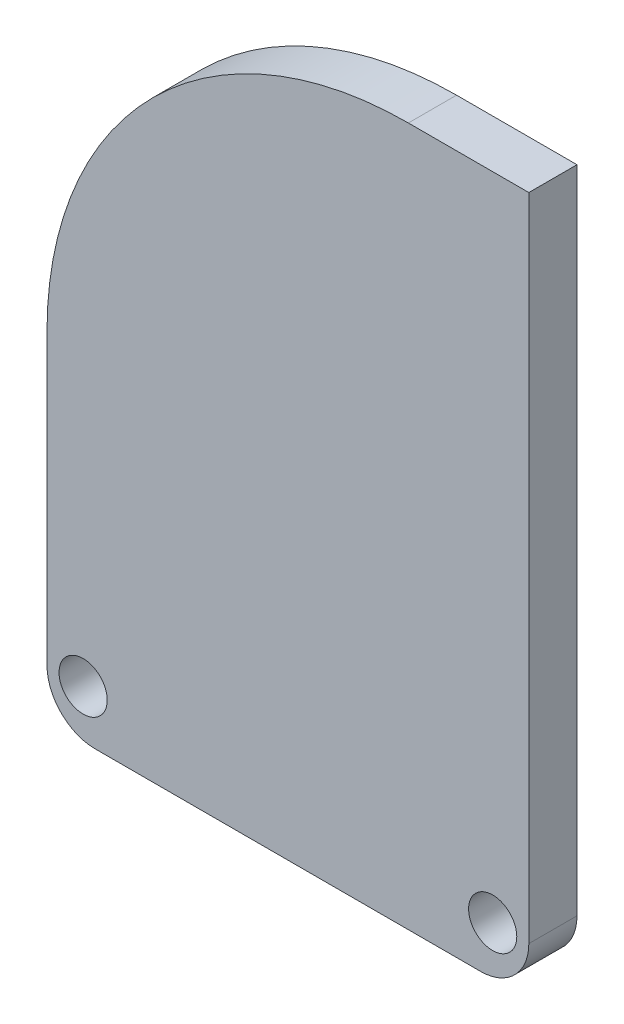
ISO-10303-21;
HEADER;
FILE_DESCRIPTION(('STEP AP214'),'2;1');
FILE_NAME('part.step','',(''),(''),'','','');
FILE_SCHEMA(('AUTOMOTIVE_DESIGN { 1 0 10303 214 1 1 1 1 }'));
ENDSEC;
DATA;
#1=APPLICATION_CONTEXT('core data for automotive mechanical design processes');
#2=APPLICATION_PROTOCOL_DEFINITION('international standard','automotive_design',2000,#1);
#3=PRODUCT_CONTEXT('',#1,'mechanical');
#4=PRODUCT('Part','Part','',(#3));
#5=PRODUCT_RELATED_PRODUCT_CATEGORY('part','',(#4));
#6=PRODUCT_DEFINITION_FORMATION('','',#4);
#7=PRODUCT_DEFINITION_CONTEXT('part definition',#1,'design');
#8=PRODUCT_DEFINITION('design','',#6,#7);
#9=PRODUCT_DEFINITION_SHAPE('','',#8);
#10=(LENGTH_UNIT() NAMED_UNIT(*) SI_UNIT(.MILLI.,.METRE.));
#11=(NAMED_UNIT(*) PLANE_ANGLE_UNIT() SI_UNIT($,.RADIAN.));
#12=(NAMED_UNIT(*) SI_UNIT($,.STERADIAN.) SOLID_ANGLE_UNIT());
#13=UNCERTAINTY_MEASURE_WITH_UNIT(LENGTH_MEASURE(1.E-05),#10,'distance_accuracy_value','');
#14=(GEOMETRIC_REPRESENTATION_CONTEXT(3) GLOBAL_UNCERTAINTY_ASSIGNED_CONTEXT((#13)) GLOBAL_UNIT_ASSIGNED_CONTEXT((#10,
#11,#12)) REPRESENTATION_CONTEXT('',''));
#15=CARTESIAN_POINT('',(0.,0.,0.));
#16=DIRECTION('',(0.,0.,1.));
#17=DIRECTION('',(1.,0.,0.));
#18=AXIS2_PLACEMENT_3D('',#15,#16,#17);
#19=CARTESIAN_POINT('',(-18.,-27.,2.));
#20=DIRECTION('',(0.,0.,-1.));
#21=DIRECTION('',(-1.,0.,0.));
#22=AXIS2_PLACEMENT_3D('',#19,#20,#21);
#23=CYLINDRICAL_SURFACE('',#22,2.);
#24=CARTESIAN_POINT('',(-18.,-27.,0.));
#25=DIRECTION('',(0.,0.,1.));
#26=DIRECTION('',(1.,0.,0.));
#27=AXIS2_PLACEMENT_3D('',#24,#25,#26);
#28=CIRCLE('',#27,2.);
#29=CARTESIAN_POINT('',(-18.,-29.,0.));
#30=VERTEX_POINT('',#29);
#31=CARTESIAN_POINT('',(-20.,-27.,0.));
#32=VERTEX_POINT('',#31);
#33=EDGE_CURVE('E141',#30,#32,#28,.F.);
#34=ORIENTED_EDGE('',*,*,#33,.F.);
#35=DIRECTION('',(0.,0.,-1.));
#36=VECTOR('',#35,1.);
#37=CARTESIAN_POINT('',(-18.,-29.,2.));
#38=LINE('',#37,#36);
#39=CARTESIAN_POINT('',(-18.,-29.,2.));
#40=VERTEX_POINT('',#39);
#41=EDGE_CURVE('E11',#40,#30,#38,.T.);
#42=ORIENTED_EDGE('',*,*,#41,.F.);
#43=CARTESIAN_POINT('',(-18.,-27.,2.));
#44=DIRECTION('',(0.,0.,1.));
#45=DIRECTION('',(1.,0.,0.));
#46=AXIS2_PLACEMENT_3D('',#43,#44,#45);
#47=CIRCLE('',#46,2.);
#48=CARTESIAN_POINT('',(-20.,-27.,2.));
#49=VERTEX_POINT('',#48);
#50=EDGE_CURVE('E265',#40,#49,#47,.F.);
#51=ORIENTED_EDGE('',*,*,#50,.T.);
#52=DIRECTION('',(0.,0.,-1.));
#53=VECTOR('',#52,1.);
#54=CARTESIAN_POINT('',(-20.,-27.,2.));
#55=LINE('',#54,#53);
#56=EDGE_CURVE('E82',#49,#32,#55,.T.);
#57=ORIENTED_EDGE('',*,*,#56,.T.);
#58=EDGE_LOOP('',(#34,#42,#51,#57));
#59=FACE_BOUND('',#58,.T.);
#60=ADVANCED_FACE('F34',(#59),#23,.T.);
#61=CARTESIAN_POINT('',(0.,-29.,2.));
#62=DIRECTION('',(0.,-1.,0.));
#63=DIRECTION('',(1.,0.,0.));
#64=AXIS2_PLACEMENT_3D('',#61,#62,#63);
#65=PLANE('',#64);
#66=DIRECTION('',(-1.,0.,0.));
#67=VECTOR('',#66,1.);
#68=CARTESIAN_POINT('',(0.,-29.,0.));
#69=LINE('',#68,#67);
#70=CARTESIAN_POINT('',(-2.,-29.,0.));
#71=VERTEX_POINT('',#70);
#72=EDGE_CURVE('E139',#71,#30,#69,.T.);
#73=ORIENTED_EDGE('',*,*,#72,.F.);
#74=DIRECTION('',(0.,0.,-1.));
#75=VECTOR('',#74,1.);
#76=CARTESIAN_POINT('',(-2.,-29.,2.));
#77=LINE('',#76,#75);
#78=CARTESIAN_POINT('',(-2.,-29.,2.));
#79=VERTEX_POINT('',#78);
#80=EDGE_CURVE('E43',#79,#71,#77,.T.);
#81=ORIENTED_EDGE('',*,*,#80,.F.);
#82=DIRECTION('',(-1.,0.,0.));
#83=VECTOR('',#82,1.);
#84=CARTESIAN_POINT('',(0.,-29.,2.));
#85=LINE('',#84,#83);
#86=EDGE_CURVE('E262',#79,#40,#85,.T.);
#87=ORIENTED_EDGE('',*,*,#86,.T.);
#88=ORIENTED_EDGE('',*,*,#41,.T.);
#89=EDGE_LOOP('',(#73,#81,#87,#88));
#90=FACE_BOUND('',#89,.T.);
#91=ADVANCED_FACE('F140',(#90),#65,.T.);
#92=CARTESIAN_POINT('',(-2.,-27.,2.));
#93=DIRECTION('',(0.,0.,-1.));
#94=DIRECTION('',(-1.,0.,0.));
#95=AXIS2_PLACEMENT_3D('',#92,#93,#94);
#96=CYLINDRICAL_SURFACE('',#95,2.);
#97=CARTESIAN_POINT('',(-2.,-27.,0.));
#98=DIRECTION('',(0.,0.,1.));
#99=DIRECTION('',(1.,0.,0.));
#100=AXIS2_PLACEMENT_3D('',#97,#98,#99);
#101=CIRCLE('',#100,2.);
#102=CARTESIAN_POINT('',(0.,-27.,0.));
#103=VERTEX_POINT('',#102);
#104=EDGE_CURVE('E132',#103,#71,#101,.F.);
#105=ORIENTED_EDGE('',*,*,#104,.F.);
#106=DIRECTION('',(0.,0.,-1.));
#107=VECTOR('',#106,1.);
#108=CARTESIAN_POINT('',(0.,-27.,2.));
#109=LINE('',#108,#107);
#110=CARTESIAN_POINT('',(0.,-27.,2.));
#111=VERTEX_POINT('',#110);
#112=EDGE_CURVE('E121',#111,#103,#109,.T.);
#113=ORIENTED_EDGE('',*,*,#112,.F.);
#114=CARTESIAN_POINT('',(-2.,-27.,2.));
#115=DIRECTION('',(0.,0.,1.));
#116=DIRECTION('',(1.,0.,0.));
#117=AXIS2_PLACEMENT_3D('',#114,#115,#116);
#118=CIRCLE('',#117,2.);
#119=EDGE_CURVE('E134',#111,#79,#118,.F.);
#120=ORIENTED_EDGE('',*,*,#119,.T.);
#121=ORIENTED_EDGE('',*,*,#80,.T.);
#122=EDGE_LOOP('',(#105,#113,#120,#121));
#123=FACE_BOUND('',#122,.T.);
#124=ADVANCED_FACE('F130',(#123),#96,.T.);
#125=CARTESIAN_POINT('',(0.,0.,2.));
#126=DIRECTION('',(1.,0.,0.));
#127=DIRECTION('',(0.,1.,0.));
#128=AXIS2_PLACEMENT_3D('',#125,#126,#127);
#129=PLANE('',#128);
#130=DIRECTION('',(0.,-1.,0.));
#131=VECTOR('',#130,1.);
#132=CARTESIAN_POINT('',(0.,0.,0.));
#133=LINE('',#132,#131);
#134=CARTESIAN_POINT('',(0.,0.,0.));
#135=VERTEX_POINT('',#134);
#136=EDGE_CURVE('E145',#135,#103,#133,.T.);
#137=ORIENTED_EDGE('',*,*,#136,.F.);
#138=DIRECTION('',(0.,0.,-1.));
#139=VECTOR('',#138,1.);
#140=CARTESIAN_POINT('',(0.,0.,2.));
#141=LINE('',#140,#139);
#142=CARTESIAN_POINT('',(0.,0.,2.));
#143=VERTEX_POINT('',#142);
#144=EDGE_CURVE('E119',#143,#135,#141,.T.);
#145=ORIENTED_EDGE('',*,*,#144,.F.);
#146=DIRECTION('',(0.,-1.,0.));
#147=VECTOR('',#146,1.);
#148=CARTESIAN_POINT('',(0.,0.,2.));
#149=LINE('',#148,#147);
#150=EDGE_CURVE('E113',#143,#111,#149,.T.);
#151=ORIENTED_EDGE('',*,*,#150,.T.);
#152=ORIENTED_EDGE('',*,*,#112,.T.);
#153=EDGE_LOOP('',(#137,#145,#151,#152));
#154=FACE_BOUND('',#153,.T.);
#155=ADVANCED_FACE('F198',(#154),#129,.T.);
#156=CARTESIAN_POINT('',(0.,0.,2.));
#157=DIRECTION('',(0.,-1.,0.));
#158=DIRECTION('',(0.,0.,-1.));
#159=AXIS2_PLACEMENT_3D('',#156,#157,#158);
#160=PLANE('',#159);
#161=DIRECTION('',(-1.,0.,0.));
#162=VECTOR('',#161,1.);
#163=CARTESIAN_POINT('',(0.,0.,0.));
#164=LINE('',#163,#162);
#165=CARTESIAN_POINT('',(-5.,0.,0.));
#166=VERTEX_POINT('',#165);
#167=EDGE_CURVE('E118',#135,#166,#164,.T.);
#168=ORIENTED_EDGE('',*,*,#167,.T.);
#169=DIRECTION('',(0.,0.,-1.));
#170=VECTOR('',#169,1.);
#171=CARTESIAN_POINT('',(-5.,0.,2.));
#172=LINE('',#171,#170);
#173=CARTESIAN_POINT('',(-5.,0.,2.));
#174=VERTEX_POINT('',#173);
#175=EDGE_CURVE('E103',#174,#166,#172,.T.);
#176=ORIENTED_EDGE('',*,*,#175,.F.);
#177=DIRECTION('',(-1.,0.,0.));
#178=VECTOR('',#177,1.);
#179=CARTESIAN_POINT('',(0.,0.,2.));
#180=LINE('',#179,#178);
#181=EDGE_CURVE('E106',#143,#174,#180,.T.);
#182=ORIENTED_EDGE('',*,*,#181,.F.);
#183=ORIENTED_EDGE('',*,*,#144,.T.);
#184=EDGE_LOOP('',(#168,#176,#182,#183));
#185=FACE_BOUND('',#184,.T.);
#186=ADVANCED_FACE('F116',(#185),#160,.F.);
#187=CARTESIAN_POINT('',(-5.,-15.,2.));
#188=DIRECTION('',(0.,0.,-1.));
#189=DIRECTION('',(-1.,0.,0.));
#190=AXIS2_PLACEMENT_3D('',#187,#188,#189);
#191=CYLINDRICAL_SURFACE('',#190,15.);
#192=CARTESIAN_POINT('',(-5.,-15.,0.));
#193=DIRECTION('',(0.,0.,1.));
#194=DIRECTION('',(1.,0.,0.));
#195=AXIS2_PLACEMENT_3D('',#192,#193,#194);
#196=CIRCLE('',#195,15.);
#197=CARTESIAN_POINT('',(-20.,-15.,0.));
#198=VERTEX_POINT('',#197);
#199=EDGE_CURVE('E151',#166,#198,#196,.T.);
#200=ORIENTED_EDGE('',*,*,#199,.T.);
#201=DIRECTION('',(0.,0.,-1.));
#202=VECTOR('',#201,1.);
#203=CARTESIAN_POINT('',(-20.,-15.,2.));
#204=LINE('',#203,#202);
#205=CARTESIAN_POINT('',(-20.,-15.,2.));
#206=VERTEX_POINT('',#205);
#207=EDGE_CURVE('E105',#206,#198,#204,.T.);
#208=ORIENTED_EDGE('',*,*,#207,.F.);
#209=CARTESIAN_POINT('',(-5.,-15.,2.));
#210=DIRECTION('',(0.,0.,1.));
#211=DIRECTION('',(1.,0.,0.));
#212=AXIS2_PLACEMENT_3D('',#209,#210,#211);
#213=CIRCLE('',#212,15.);
#214=EDGE_CURVE('E98',#174,#206,#213,.T.);
#215=ORIENTED_EDGE('',*,*,#214,.F.);
#216=ORIENTED_EDGE('',*,*,#175,.T.);
#217=EDGE_LOOP('',(#200,#208,#215,#216));
#218=FACE_BOUND('',#217,.T.);
#219=ADVANCED_FACE('F101',(#218),#191,.T.);
#220=CARTESIAN_POINT('',(-18.5,-27.,2.));
#221=DIRECTION('',(0.,0.,-1.));
#222=DIRECTION('',(-1.,0.,0.));
#223=AXIS2_PLACEMENT_3D('',#220,#221,#222);
#224=CYLINDRICAL_SURFACE('',#223,1.);
#225=CARTESIAN_POINT('',(-18.5,-27.,2.));
#226=DIRECTION('',(0.,0.,1.));
#227=DIRECTION('',(1.,0.,0.));
#228=AXIS2_PLACEMENT_3D('',#225,#226,#227);
#229=CIRCLE('',#228,1.);
#230=CARTESIAN_POINT('',(-17.5,-27.,2.));
#231=VERTEX_POINT('',#230);
#232=EDGE_CURVE('E181',#231,#231,#229,.T.);
#233=ORIENTED_EDGE('',*,*,#232,.T.);
#234=EDGE_LOOP('',(#233));
#235=FACE_BOUND('',#234,.T.);
#236=CARTESIAN_POINT('',(-18.5,-27.,0.));
#237=DIRECTION('',(0.,0.,1.));
#238=DIRECTION('',(1.,0.,0.));
#239=AXIS2_PLACEMENT_3D('',#236,#237,#238);
#240=CIRCLE('',#239,1.);
#241=CARTESIAN_POINT('',(-17.5,-27.,0.));
#242=VERTEX_POINT('',#241);
#243=EDGE_CURVE('E159',#242,#242,#240,.T.);
#244=ORIENTED_EDGE('',*,*,#243,.F.);
#245=EDGE_LOOP('',(#244));
#246=FACE_BOUND('',#245,.T.);
#247=ADVANCED_FACE('F168',(#235,#246),#224,.F.);
#248=CARTESIAN_POINT('',(-1.5,-27.,2.));
#249=DIRECTION('',(0.,0.,-1.));
#250=DIRECTION('',(-1.,0.,0.));
#251=AXIS2_PLACEMENT_3D('',#248,#249,#250);
#252=CYLINDRICAL_SURFACE('',#251,1.);
#253=CARTESIAN_POINT('',(-1.5,-27.,2.));
#254=DIRECTION('',(0.,0.,1.));
#255=DIRECTION('',(1.,0.,0.));
#256=AXIS2_PLACEMENT_3D('',#253,#254,#255);
#257=CIRCLE('',#256,1.);
#258=CARTESIAN_POINT('',(-0.499999999999996,-27.,2.));
#259=VERTEX_POINT('',#258);
#260=EDGE_CURVE('E153',#259,#259,#257,.T.);
#261=ORIENTED_EDGE('',*,*,#260,.T.);
#262=EDGE_LOOP('',(#261));
#263=FACE_BOUND('',#262,.T.);
#264=CARTESIAN_POINT('',(-1.5,-27.,0.));
#265=DIRECTION('',(0.,0.,1.));
#266=DIRECTION('',(1.,0.,0.));
#267=AXIS2_PLACEMENT_3D('',#264,#265,#266);
#268=CIRCLE('',#267,1.);
#269=CARTESIAN_POINT('',(-0.499999999999996,-27.,0.));
#270=VERTEX_POINT('',#269);
#271=EDGE_CURVE('E156',#270,#270,#268,.T.);
#272=ORIENTED_EDGE('',*,*,#271,.F.);
#273=EDGE_LOOP('',(#272));
#274=FACE_BOUND('',#273,.T.);
#275=ADVANCED_FACE('F36',(#263,#274),#252,.F.);
#276=CARTESIAN_POINT('',(-20.,0.,2.));
#277=DIRECTION('',(1.,0.,0.));
#278=DIRECTION('',(0.,0.,-1.));
#279=AXIS2_PLACEMENT_3D('',#276,#277,#278);
#280=PLANE('',#279);
#281=DIRECTION('',(0.,-1.,0.));
#282=VECTOR('',#281,1.);
#283=CARTESIAN_POINT('',(-20.,0.,0.));
#284=LINE('',#283,#282);
#285=EDGE_CURVE('E75',#198,#32,#284,.T.);
#286=ORIENTED_EDGE('',*,*,#285,.T.);
#287=ORIENTED_EDGE('',*,*,#56,.F.);
#288=DIRECTION('',(0.,-1.,0.));
#289=VECTOR('',#288,1.);
#290=CARTESIAN_POINT('',(-20.,0.,2.));
#291=LINE('',#290,#289);
#292=EDGE_CURVE('E51',#206,#49,#291,.T.);
#293=ORIENTED_EDGE('',*,*,#292,.F.);
#294=ORIENTED_EDGE('',*,*,#207,.T.);
#295=EDGE_LOOP('',(#286,#287,#293,#294));
#296=FACE_BOUND('',#295,.T.);
#297=ADVANCED_FACE('F175',(#296),#280,.F.);
#298=CARTESIAN_POINT('',(0.,0.,2.));
#299=DIRECTION('',(0.,0.,1.));
#300=DIRECTION('',(1.,0.,0.));
#301=AXIS2_PLACEMENT_3D('',#298,#299,#300);
#302=PLANE('',#301);
#303=ORIENTED_EDGE('',*,*,#260,.F.);
#304=EDGE_LOOP('',(#303));
#305=FACE_BOUND('',#304,.T.);
#306=ORIENTED_EDGE('',*,*,#232,.F.);
#307=EDGE_LOOP('',(#306));
#308=FACE_BOUND('',#307,.T.);
#309=ORIENTED_EDGE('',*,*,#50,.F.);
#310=ORIENTED_EDGE('',*,*,#86,.F.);
#311=ORIENTED_EDGE('',*,*,#119,.F.);
#312=ORIENTED_EDGE('',*,*,#150,.F.);
#313=ORIENTED_EDGE('',*,*,#181,.T.);
#314=ORIENTED_EDGE('',*,*,#214,.T.);
#315=ORIENTED_EDGE('',*,*,#292,.T.);
#316=EDGE_LOOP('',(#309,#310,#311,#312,#313,#314,#315));
#317=FACE_BOUND('',#316,.T.);
#318=ADVANCED_FACE('F110',(#305,#308,#317),#302,.T.);
#319=CARTESIAN_POINT('',(0.,0.,0.));
#320=DIRECTION('',(0.,0.,1.));
#321=DIRECTION('',(1.,0.,0.));
#322=AXIS2_PLACEMENT_3D('',#319,#320,#321);
#323=PLANE('',#322);
#324=ORIENTED_EDGE('',*,*,#271,.T.);
#325=EDGE_LOOP('',(#324));
#326=FACE_BOUND('',#325,.T.);
#327=ORIENTED_EDGE('',*,*,#243,.T.);
#328=EDGE_LOOP('',(#327));
#329=FACE_BOUND('',#328,.T.);
#330=ORIENTED_EDGE('',*,*,#33,.T.);
#331=ORIENTED_EDGE('',*,*,#285,.F.);
#332=ORIENTED_EDGE('',*,*,#199,.F.);
#333=ORIENTED_EDGE('',*,*,#167,.F.);
#334=ORIENTED_EDGE('',*,*,#136,.T.);
#335=ORIENTED_EDGE('',*,*,#104,.T.);
#336=ORIENTED_EDGE('',*,*,#72,.T.);
#337=EDGE_LOOP('',(#330,#331,#332,#333,#334,#335,#336));
#338=FACE_BOUND('',#337,.T.);
#339=ADVANCED_FACE('F143',(#326,#329,#338),#323,.F.);
#340=CLOSED_SHELL('',(#60,#91,#124,#155,#186,#219,#247,#275,#297,#318,#339));
#341=MANIFOLD_SOLID_BREP('B2',#340);
#342=ADVANCED_BREP_SHAPE_REPRESENTATION('',(#18,#341),#14);
#343=SHAPE_DEFINITION_REPRESENTATION(#9,#342);
ENDSEC;
END-ISO-10303-21;
